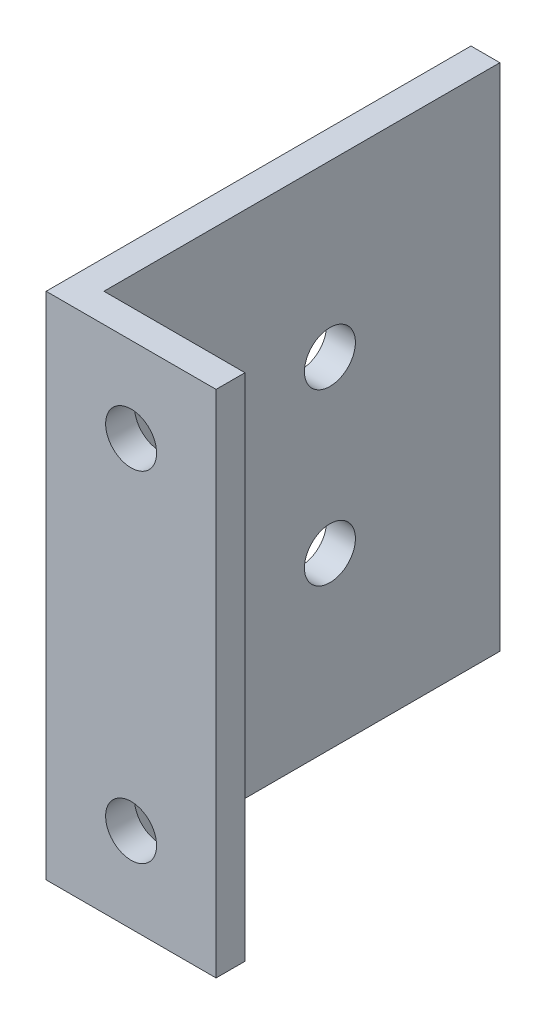
ISO-10303-21;
HEADER;
FILE_DESCRIPTION(('STEP AP214'),'2;1');
FILE_NAME('part.step','',(''),(''),'','','');
FILE_SCHEMA(('AUTOMOTIVE_DESIGN { 1 0 10303 214 1 1 1 1 }'));
ENDSEC;
DATA;
#1=APPLICATION_CONTEXT('core data for automotive mechanical design processes');
#2=APPLICATION_PROTOCOL_DEFINITION('international standard','automotive_design',2000,#1);
#3=PRODUCT_CONTEXT('',#1,'mechanical');
#4=PRODUCT('Part','Part','',(#3));
#5=PRODUCT_RELATED_PRODUCT_CATEGORY('part','',(#4));
#6=PRODUCT_DEFINITION_FORMATION('','',#4);
#7=PRODUCT_DEFINITION_CONTEXT('part definition',#1,'design');
#8=PRODUCT_DEFINITION('design','',#6,#7);
#9=PRODUCT_DEFINITION_SHAPE('','',#8);
#10=(LENGTH_UNIT() NAMED_UNIT(*) SI_UNIT(.MILLI.,.METRE.));
#11=(NAMED_UNIT(*) PLANE_ANGLE_UNIT() SI_UNIT($,.RADIAN.));
#12=(NAMED_UNIT(*) SI_UNIT($,.STERADIAN.) SOLID_ANGLE_UNIT());
#13=UNCERTAINTY_MEASURE_WITH_UNIT(LENGTH_MEASURE(1.E-05),#10,'distance_accuracy_value','');
#14=(GEOMETRIC_REPRESENTATION_CONTEXT(3) GLOBAL_UNCERTAINTY_ASSIGNED_CONTEXT((#13)) GLOBAL_UNIT_ASSIGNED_CONTEXT((#10,
#11,#12)) REPRESENTATION_CONTEXT('',''));
#15=CARTESIAN_POINT('',(0.,0.,0.));
#16=DIRECTION('',(0.,0.,1.));
#17=DIRECTION('',(1.,0.,0.));
#18=AXIS2_PLACEMENT_3D('',#15,#16,#17);
#19=CARTESIAN_POINT('',(0.,30.,0.));
#20=DIRECTION('',(0.,0.,-1.));
#21=DIRECTION('',(-1.,0.,0.));
#22=AXIS2_PLACEMENT_3D('',#19,#20,#21);
#23=PLANE('',#22);
#24=CARTESIAN_POINT('',(5.,5.,0.));
#25=DIRECTION('',(0.,0.,1.));
#26=DIRECTION('',(1.,0.,0.));
#27=AXIS2_PLACEMENT_3D('',#24,#25,#26);
#28=CIRCLE('',#27,1.5);
#29=CARTESIAN_POINT('',(6.5,5.,0.));
#30=VERTEX_POINT('',#29);
#31=EDGE_CURVE('E141',#30,#30,#28,.T.);
#32=ORIENTED_EDGE('',*,*,#31,.F.);
#33=EDGE_LOOP('',(#32));
#34=FACE_BOUND('',#33,.T.);
#35=CARTESIAN_POINT('',(5.,25.,0.));
#36=DIRECTION('',(0.,0.,1.));
#37=DIRECTION('',(1.,0.,0.));
#38=AXIS2_PLACEMENT_3D('',#35,#36,#37);
#39=CIRCLE('',#38,1.5);
#40=CARTESIAN_POINT('',(6.5,25.,0.));
#41=VERTEX_POINT('',#40);
#42=EDGE_CURVE('E138',#41,#41,#39,.T.);
#43=ORIENTED_EDGE('',*,*,#42,.F.);
#44=EDGE_LOOP('',(#43));
#45=FACE_BOUND('',#44,.T.);
#46=DIRECTION('',(1.,0.,0.));
#47=VECTOR('',#46,1.);
#48=CARTESIAN_POINT('',(0.,0.,0.));
#49=LINE('',#48,#47);
#50=CARTESIAN_POINT('',(0.,0.,0.));
#51=VERTEX_POINT('',#50);
#52=CARTESIAN_POINT('',(10.,0.,0.));
#53=VERTEX_POINT('',#52);
#54=EDGE_CURVE('E118',#51,#53,#49,.T.);
#55=ORIENTED_EDGE('',*,*,#54,.T.);
#56=DIRECTION('',(0.,1.,0.));
#57=VECTOR('',#56,1.);
#58=CARTESIAN_POINT('',(10.,-10.,0.));
#59=LINE('',#58,#57);
#60=CARTESIAN_POINT('',(10.,30.,0.));
#61=VERTEX_POINT('',#60);
#62=EDGE_CURVE('E46',#53,#61,#59,.T.);
#63=ORIENTED_EDGE('',*,*,#62,.T.);
#64=DIRECTION('',(1.,0.,0.));
#65=VECTOR('',#64,1.);
#66=CARTESIAN_POINT('',(0.,30.,0.));
#67=LINE('',#66,#65);
#68=CARTESIAN_POINT('',(0.,30.,0.));
#69=VERTEX_POINT('',#68);
#70=EDGE_CURVE('E103',#69,#61,#67,.T.);
#71=ORIENTED_EDGE('',*,*,#70,.F.);
#72=DIRECTION('',(0.,-1.,0.));
#73=VECTOR('',#72,1.);
#74=CARTESIAN_POINT('',(0.,30.,0.));
#75=LINE('',#74,#73);
#76=EDGE_CURVE('E117',#69,#51,#75,.T.);
#77=ORIENTED_EDGE('',*,*,#76,.T.);
#78=EDGE_LOOP('',(#55,#63,#71,#77));
#79=FACE_BOUND('',#78,.T.);
#80=ADVANCED_FACE('F33',(#34,#45,#79),#23,.F.);
#81=CARTESIAN_POINT('',(0.,30.,-1.7));
#82=DIRECTION('',(0.,0.,-1.));
#83=DIRECTION('',(-1.,0.,0.));
#84=AXIS2_PLACEMENT_3D('',#81,#82,#83);
#85=PLANE('',#84);
#86=DIRECTION('',(0.,1.,0.));
#87=VECTOR('',#86,1.);
#88=CARTESIAN_POINT('',(10.,-10.,-1.7));
#89=LINE('',#88,#87);
#90=CARTESIAN_POINT('',(10.,0.,-1.7));
#91=VERTEX_POINT('',#90);
#92=CARTESIAN_POINT('',(10.,30.,-1.7));
#93=VERTEX_POINT('',#92);
#94=EDGE_CURVE('E92',#91,#93,#89,.T.);
#95=ORIENTED_EDGE('',*,*,#94,.F.);
#96=DIRECTION('',(1.,0.,0.));
#97=VECTOR('',#96,1.);
#98=CARTESIAN_POINT('',(0.,0.,-1.7));
#99=LINE('',#98,#97);
#100=CARTESIAN_POINT('',(1.7,0.,-1.7));
#101=VERTEX_POINT('',#100);
#102=EDGE_CURVE('E121',#101,#91,#99,.T.);
#103=ORIENTED_EDGE('',*,*,#102,.F.);
#104=DIRECTION('',(0.,-1.,0.));
#105=VECTOR('',#104,1.);
#106=CARTESIAN_POINT('',(1.7,30.,-1.7));
#107=LINE('',#106,#105);
#108=CARTESIAN_POINT('',(1.7,30.,-1.7));
#109=VERTEX_POINT('',#108);
#110=EDGE_CURVE('E40',#109,#101,#107,.T.);
#111=ORIENTED_EDGE('',*,*,#110,.F.);
#112=DIRECTION('',(1.,0.,0.));
#113=VECTOR('',#112,1.);
#114=CARTESIAN_POINT('',(0.,30.,-1.7));
#115=LINE('',#114,#113);
#116=EDGE_CURVE('E100',#109,#93,#115,.T.);
#117=ORIENTED_EDGE('',*,*,#116,.T.);
#118=EDGE_LOOP('',(#95,#103,#111,#117));
#119=FACE_BOUND('',#118,.T.);
#120=CARTESIAN_POINT('',(5.,5.,-1.7));
#121=DIRECTION('',(0.,0.,-1.));
#122=DIRECTION('',(-1.,0.,0.));
#123=AXIS2_PLACEMENT_3D('',#120,#121,#122);
#124=CIRCLE('',#123,1.5);
#125=CARTESIAN_POINT('',(3.5,5.,-1.7));
#126=VERTEX_POINT('',#125);
#127=EDGE_CURVE('E139',#126,#126,#124,.T.);
#128=ORIENTED_EDGE('',*,*,#127,.F.);
#129=EDGE_LOOP('',(#128));
#130=FACE_BOUND('',#129,.T.);
#131=CARTESIAN_POINT('',(5.,25.,-1.7));
#132=DIRECTION('',(0.,0.,-1.));
#133=DIRECTION('',(-1.,0.,0.));
#134=AXIS2_PLACEMENT_3D('',#131,#132,#133);
#135=CIRCLE('',#134,1.5);
#136=CARTESIAN_POINT('',(3.5,25.,-1.7));
#137=VERTEX_POINT('',#136);
#138=EDGE_CURVE('E122',#137,#137,#135,.T.);
#139=ORIENTED_EDGE('',*,*,#138,.F.);
#140=EDGE_LOOP('',(#139));
#141=FACE_BOUND('',#140,.T.);
#142=ADVANCED_FACE('F105',(#119,#130,#141),#85,.T.);
#143=CARTESIAN_POINT('',(1.7,30.,-25.));
#144=DIRECTION('',(1.,0.,0.));
#145=DIRECTION('',(0.,0.,-1.));
#146=AXIS2_PLACEMENT_3D('',#143,#144,#145);
#147=PLANE('',#146);
#148=CARTESIAN_POINT('',(1.7,20.,-15.));
#149=DIRECTION('',(1.,0.,0.));
#150=DIRECTION('',(0.,0.,-1.));
#151=AXIS2_PLACEMENT_3D('',#148,#149,#150);
#152=CIRCLE('',#151,1.5);
#153=CARTESIAN_POINT('',(1.7,20.,-16.5));
#154=VERTEX_POINT('',#153);
#155=EDGE_CURVE('E156',#154,#154,#152,.T.);
#156=ORIENTED_EDGE('',*,*,#155,.F.);
#157=EDGE_LOOP('',(#156));
#158=FACE_BOUND('',#157,.T.);
#159=CARTESIAN_POINT('',(1.7,10.,-15.));
#160=DIRECTION('',(1.,0.,0.));
#161=DIRECTION('',(0.,0.,-1.));
#162=AXIS2_PLACEMENT_3D('',#159,#160,#161);
#163=CIRCLE('',#162,1.5);
#164=CARTESIAN_POINT('',(1.7,10.,-16.5));
#165=VERTEX_POINT('',#164);
#166=EDGE_CURVE('E146',#165,#165,#163,.T.);
#167=ORIENTED_EDGE('',*,*,#166,.F.);
#168=EDGE_LOOP('',(#167));
#169=FACE_BOUND('',#168,.T.);
#170=DIRECTION('',(0.,0.,-1.));
#171=VECTOR('',#170,1.);
#172=CARTESIAN_POINT('',(1.7,0.,-25.));
#173=LINE('',#172,#171);
#174=CARTESIAN_POINT('',(1.7,0.,-25.));
#175=VERTEX_POINT('',#174);
#176=EDGE_CURVE('E124',#175,#101,#173,.F.);
#177=ORIENTED_EDGE('',*,*,#176,.F.);
#178=DIRECTION('',(0.,-1.,0.));
#179=VECTOR('',#178,1.);
#180=CARTESIAN_POINT('',(1.7,30.,-25.));
#181=LINE('',#180,#179);
#182=CARTESIAN_POINT('',(1.7,30.,-25.));
#183=VERTEX_POINT('',#182);
#184=EDGE_CURVE('E134',#183,#175,#181,.T.);
#185=ORIENTED_EDGE('',*,*,#184,.F.);
#186=DIRECTION('',(0.,0.,-1.));
#187=VECTOR('',#186,1.);
#188=CARTESIAN_POINT('',(1.7,30.,-25.));
#189=LINE('',#188,#187);
#190=EDGE_CURVE('E107',#183,#109,#189,.F.);
#191=ORIENTED_EDGE('',*,*,#190,.T.);
#192=ORIENTED_EDGE('',*,*,#110,.T.);
#193=EDGE_LOOP('',(#177,#185,#191,#192));
#194=FACE_BOUND('',#193,.T.);
#195=ADVANCED_FACE('F169',(#158,#169,#194),#147,.T.);
#196=CARTESIAN_POINT('',(0.,30.,-25.));
#197=DIRECTION('',(0.,0.,-1.));
#198=DIRECTION('',(-1.,0.,0.));
#199=AXIS2_PLACEMENT_3D('',#196,#197,#198);
#200=PLANE('',#199);
#201=DIRECTION('',(1.,0.,0.));
#202=VECTOR('',#201,1.);
#203=CARTESIAN_POINT('',(0.,0.,-25.));
#204=LINE('',#203,#202);
#205=CARTESIAN_POINT('',(0.,0.,-25.));
#206=VERTEX_POINT('',#205);
#207=EDGE_CURVE('E127',#206,#175,#204,.T.);
#208=ORIENTED_EDGE('',*,*,#207,.F.);
#209=DIRECTION('',(0.,-1.,0.));
#210=VECTOR('',#209,1.);
#211=CARTESIAN_POINT('',(0.,30.,-25.));
#212=LINE('',#211,#210);
#213=CARTESIAN_POINT('',(0.,30.,-25.));
#214=VERTEX_POINT('',#213);
#215=EDGE_CURVE('E132',#214,#206,#212,.T.);
#216=ORIENTED_EDGE('',*,*,#215,.F.);
#217=DIRECTION('',(1.,0.,0.));
#218=VECTOR('',#217,1.);
#219=CARTESIAN_POINT('',(0.,30.,-25.));
#220=LINE('',#219,#218);
#221=EDGE_CURVE('E109',#214,#183,#220,.T.);
#222=ORIENTED_EDGE('',*,*,#221,.T.);
#223=ORIENTED_EDGE('',*,*,#184,.T.);
#224=EDGE_LOOP('',(#208,#216,#222,#223));
#225=FACE_BOUND('',#224,.T.);
#226=ADVANCED_FACE('F171',(#225),#200,.T.);
#227=CARTESIAN_POINT('',(0.,30.,-25.));
#228=DIRECTION('',(1.,0.,0.));
#229=DIRECTION('',(0.,0.,-1.));
#230=AXIS2_PLACEMENT_3D('',#227,#228,#229);
#231=PLANE('',#230);
#232=CARTESIAN_POINT('',(0.,20.,-15.));
#233=DIRECTION('',(-1.,0.,0.));
#234=DIRECTION('',(0.,0.,1.));
#235=AXIS2_PLACEMENT_3D('',#232,#233,#234);
#236=CIRCLE('',#235,1.5);
#237=CARTESIAN_POINT('',(0.,20.,-13.5));
#238=VERTEX_POINT('',#237);
#239=EDGE_CURVE('E159',#238,#238,#236,.T.);
#240=ORIENTED_EDGE('',*,*,#239,.F.);
#241=EDGE_LOOP('',(#240));
#242=FACE_BOUND('',#241,.T.);
#243=CARTESIAN_POINT('',(0.,10.,-15.));
#244=DIRECTION('',(-1.,0.,0.));
#245=DIRECTION('',(0.,0.,1.));
#246=AXIS2_PLACEMENT_3D('',#243,#244,#245);
#247=CIRCLE('',#246,1.5);
#248=CARTESIAN_POINT('',(0.,10.,-13.5));
#249=VERTEX_POINT('',#248);
#250=EDGE_CURVE('E151',#249,#249,#247,.T.);
#251=ORIENTED_EDGE('',*,*,#250,.F.);
#252=EDGE_LOOP('',(#251));
#253=FACE_BOUND('',#252,.T.);
#254=DIRECTION('',(0.,0.,1.));
#255=VECTOR('',#254,1.);
#256=CARTESIAN_POINT('',(0.,0.,-25.));
#257=LINE('',#256,#255);
#258=EDGE_CURVE('E76',#206,#51,#257,.T.);
#259=ORIENTED_EDGE('',*,*,#258,.T.);
#260=ORIENTED_EDGE('',*,*,#76,.F.);
#261=DIRECTION('',(0.,0.,1.));
#262=VECTOR('',#261,1.);
#263=CARTESIAN_POINT('',(0.,30.,-25.));
#264=LINE('',#263,#262);
#265=EDGE_CURVE('E55',#214,#69,#264,.T.);
#266=ORIENTED_EDGE('',*,*,#265,.F.);
#267=ORIENTED_EDGE('',*,*,#215,.T.);
#268=EDGE_LOOP('',(#259,#260,#266,#267));
#269=FACE_BOUND('',#268,.T.);
#270=ADVANCED_FACE('F172',(#242,#253,#269),#231,.F.);
#271=CARTESIAN_POINT('',(0.,30.,0.));
#272=DIRECTION('',(0.,-1.,0.));
#273=DIRECTION('',(-1.,0.,0.));
#274=AXIS2_PLACEMENT_3D('',#271,#272,#273);
#275=PLANE('',#274);
#276=ORIENTED_EDGE('',*,*,#70,.T.);
#277=DIRECTION('',(0.,0.,1.));
#278=VECTOR('',#277,1.);
#279=CARTESIAN_POINT('',(10.,30.,-1.7));
#280=LINE('',#279,#278);
#281=EDGE_CURVE('E95',#93,#61,#280,.T.);
#282=ORIENTED_EDGE('',*,*,#281,.F.);
#283=ORIENTED_EDGE('',*,*,#116,.F.);
#284=ORIENTED_EDGE('',*,*,#190,.F.);
#285=ORIENTED_EDGE('',*,*,#221,.F.);
#286=ORIENTED_EDGE('',*,*,#265,.T.);
#287=EDGE_LOOP('',(#276,#282,#283,#284,#285,#286));
#288=FACE_BOUND('',#287,.T.);
#289=ADVANCED_FACE('F98',(#288),#275,.F.);
#290=CARTESIAN_POINT('',(0.,0.,0.));
#291=DIRECTION('',(0.,-1.,0.));
#292=DIRECTION('',(-1.,0.,0.));
#293=AXIS2_PLACEMENT_3D('',#290,#291,#292);
#294=PLANE('',#293);
#295=DIRECTION('',(0.,0.,-1.));
#296=VECTOR('',#295,1.);
#297=CARTESIAN_POINT('',(10.,0.,0.));
#298=LINE('',#297,#296);
#299=EDGE_CURVE('E11',#53,#91,#298,.T.);
#300=ORIENTED_EDGE('',*,*,#299,.F.);
#301=ORIENTED_EDGE('',*,*,#54,.F.);
#302=ORIENTED_EDGE('',*,*,#258,.F.);
#303=ORIENTED_EDGE('',*,*,#207,.T.);
#304=ORIENTED_EDGE('',*,*,#176,.T.);
#305=ORIENTED_EDGE('',*,*,#102,.T.);
#306=EDGE_LOOP('',(#300,#301,#302,#303,#304,#305));
#307=FACE_BOUND('',#306,.T.);
#308=ADVANCED_FACE('F165',(#307),#294,.T.);
#309=CARTESIAN_POINT('',(5.,25.,-10.));
#310=DIRECTION('',(0.,0.,1.));
#311=DIRECTION('',(1.,0.,0.));
#312=AXIS2_PLACEMENT_3D('',#309,#310,#311);
#313=CYLINDRICAL_SURFACE('',#312,1.5);
#314=ORIENTED_EDGE('',*,*,#138,.T.);
#315=EDGE_LOOP('',(#314));
#316=FACE_BOUND('',#315,.T.);
#317=ORIENTED_EDGE('',*,*,#42,.T.);
#318=EDGE_LOOP('',(#317));
#319=FACE_BOUND('',#318,.T.);
#320=ADVANCED_FACE('F195',(#316,#319),#313,.F.);
#321=CARTESIAN_POINT('',(5.,5.,-10.));
#322=DIRECTION('',(0.,0.,1.));
#323=DIRECTION('',(1.,0.,0.));
#324=AXIS2_PLACEMENT_3D('',#321,#322,#323);
#325=CYLINDRICAL_SURFACE('',#324,1.5);
#326=ORIENTED_EDGE('',*,*,#127,.T.);
#327=EDGE_LOOP('',(#326));
#328=FACE_BOUND('',#327,.T.);
#329=ORIENTED_EDGE('',*,*,#31,.T.);
#330=EDGE_LOOP('',(#329));
#331=FACE_BOUND('',#330,.T.);
#332=ADVANCED_FACE('F197',(#328,#331),#325,.F.);
#333=CARTESIAN_POINT('',(10.,10.,-15.));
#334=DIRECTION('',(-1.,0.,0.));
#335=DIRECTION('',(0.,0.,1.));
#336=AXIS2_PLACEMENT_3D('',#333,#334,#335);
#337=CYLINDRICAL_SURFACE('',#336,1.5);
#338=ORIENTED_EDGE('',*,*,#166,.T.);
#339=EDGE_LOOP('',(#338));
#340=FACE_BOUND('',#339,.T.);
#341=ORIENTED_EDGE('',*,*,#250,.T.);
#342=EDGE_LOOP('',(#341));
#343=FACE_BOUND('',#342,.T.);
#344=ADVANCED_FACE('F204',(#340,#343),#337,.F.);
#345=CARTESIAN_POINT('',(10.,20.,-15.));
#346=DIRECTION('',(-1.,0.,0.));
#347=DIRECTION('',(0.,0.,1.));
#348=AXIS2_PLACEMENT_3D('',#345,#346,#347);
#349=CYLINDRICAL_SURFACE('',#348,1.5);
#350=ORIENTED_EDGE('',*,*,#155,.T.);
#351=EDGE_LOOP('',(#350));
#352=FACE_BOUND('',#351,.T.);
#353=ORIENTED_EDGE('',*,*,#239,.T.);
#354=EDGE_LOOP('',(#353));
#355=FACE_BOUND('',#354,.T.);
#356=ADVANCED_FACE('F210',(#352,#355),#349,.F.);
#357=CARTESIAN_POINT('',(10.,-10.,-1.7));
#358=DIRECTION('',(-1.,0.,0.));
#359=DIRECTION('',(0.,0.,1.));
#360=AXIS2_PLACEMENT_3D('',#357,#358,#359);
#361=PLANE('',#360);
#362=ORIENTED_EDGE('',*,*,#299,.T.);
#363=ORIENTED_EDGE('',*,*,#94,.T.);
#364=ORIENTED_EDGE('',*,*,#281,.T.);
#365=ORIENTED_EDGE('',*,*,#62,.F.);
#366=EDGE_LOOP('',(#362,#363,#364,#365));
#367=FACE_BOUND('',#366,.T.);
#368=ADVANCED_FACE('F94',(#367),#361,.F.);
#369=CLOSED_SHELL('',(#80,#142,#195,#226,#270,#289,#308,#320,#332,#344,#356,#368));
#370=MANIFOLD_SOLID_BREP('B2',#369);
#371=ADVANCED_BREP_SHAPE_REPRESENTATION('',(#18,#370),#14);
#372=SHAPE_DEFINITION_REPRESENTATION(#9,#371);
ENDSEC;
END-ISO-10303-21;
